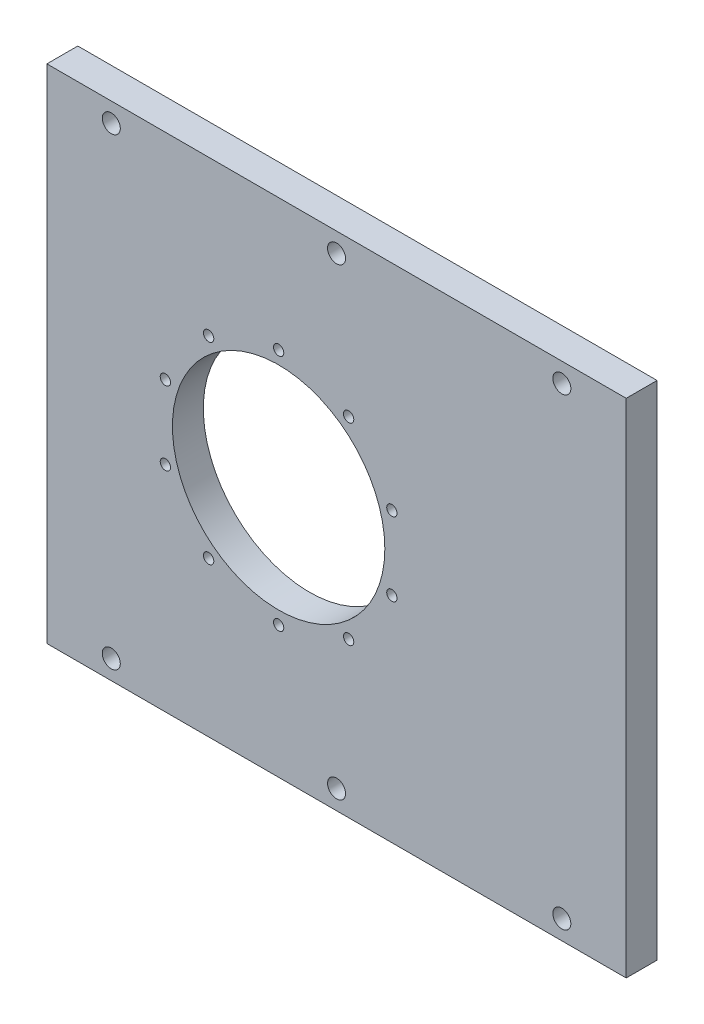
ISO-10303-21;
HEADER;
FILE_DESCRIPTION(('STEP AP214'),'2;1');
FILE_NAME('part.step','',(''),(''),'','','');
FILE_SCHEMA(('AUTOMOTIVE_DESIGN { 1 0 10303 214 1 1 1 1 }'));
ENDSEC;
DATA;
#1=APPLICATION_CONTEXT('core data for automotive mechanical design processes');
#2=APPLICATION_PROTOCOL_DEFINITION('international standard','automotive_design',2000,#1);
#3=PRODUCT_CONTEXT('',#1,'mechanical');
#4=PRODUCT('Part','Part','',(#3));
#5=PRODUCT_RELATED_PRODUCT_CATEGORY('part','',(#4));
#6=PRODUCT_DEFINITION_FORMATION('','',#4);
#7=PRODUCT_DEFINITION_CONTEXT('part definition',#1,'design');
#8=PRODUCT_DEFINITION('design','',#6,#7);
#9=PRODUCT_DEFINITION_SHAPE('','',#8);
#10=(LENGTH_UNIT() NAMED_UNIT(*) SI_UNIT(.MILLI.,.METRE.));
#11=(NAMED_UNIT(*) PLANE_ANGLE_UNIT() SI_UNIT($,.RADIAN.));
#12=(NAMED_UNIT(*) SI_UNIT($,.STERADIAN.) SOLID_ANGLE_UNIT());
#13=UNCERTAINTY_MEASURE_WITH_UNIT(LENGTH_MEASURE(1.E-05),#10,'distance_accuracy_value','');
#14=(GEOMETRIC_REPRESENTATION_CONTEXT(3) GLOBAL_UNCERTAINTY_ASSIGNED_CONTEXT((#13)) GLOBAL_UNIT_ASSIGNED_CONTEXT((#10,
#11,#12)) REPRESENTATION_CONTEXT('',''));
#15=CARTESIAN_POINT('',(0.,0.,0.));
#16=DIRECTION('',(0.,0.,1.));
#17=DIRECTION('',(1.,0.,0.));
#18=AXIS2_PLACEMENT_3D('',#15,#16,#17);
#19=CARTESIAN_POINT('',(0.,0.,24.));
#20=DIRECTION('',(0.,0.,-1.));
#21=DIRECTION('',(-1.,0.,0.));
#22=AXIS2_PLACEMENT_3D('',#19,#20,#21);
#23=PLANE('',#22);
#24=CARTESIAN_POINT('',(42.9727277573017,-28.5840719796826,24.));
#25=DIRECTION('',(0.,0.,-1.));
#26=DIRECTION('',(-1.,0.,0.));
#27=AXIS2_PLACEMENT_3D('',#24,#25,#26);
#28=CIRCLE('',#27,4.00000000000001);
#29=CARTESIAN_POINT('',(38.9727277573017,-28.5840719796826,24.));
#30=VERTEX_POINT('',#29);
#31=EDGE_CURVE('E203',#30,#30,#28,.T.);
#32=ORIENTED_EDGE('',*,*,#31,.T.);
#33=EDGE_LOOP('',(#32));
#34=FACE_BOUND('',#33,.T.);
#35=CARTESIAN_POINT('',(42.9727277573017,28.5840719796826,24.));
#36=DIRECTION('',(0.,0.,-1.));
#37=DIRECTION('',(-1.,0.,0.));
#38=AXIS2_PLACEMENT_3D('',#35,#36,#37);
#39=CIRCLE('',#38,4.00000000000001);
#40=CARTESIAN_POINT('',(38.9727277573017,28.5840719796826,24.));
#41=VERTEX_POINT('',#40);
#42=EDGE_CURVE('E209',#41,#41,#39,.T.);
#43=ORIENTED_EDGE('',*,*,#42,.T.);
#44=EDGE_LOOP('',(#43));
#45=FACE_BOUND('',#44,.T.);
#46=CARTESIAN_POINT('',(9.37013583705376,74.8340719796826,24.));
#47=DIRECTION('',(0.,0.,-1.));
#48=DIRECTION('',(-1.,0.,0.));
#49=AXIS2_PLACEMENT_3D('',#46,#47,#48);
#50=CIRCLE('',#49,4.);
#51=CARTESIAN_POINT('',(5.37013583705376,74.8340719796826,24.));
#52=VERTEX_POINT('',#51);
#53=EDGE_CURVE('E215',#52,#52,#50,.T.);
#54=ORIENTED_EDGE('',*,*,#53,.T.);
#55=EDGE_LOOP('',(#54));
#56=FACE_BOUND('',#55,.T.);
#57=CARTESIAN_POINT('',(-45.,92.5,24.));
#58=DIRECTION('',(0.,0.,-1.));
#59=DIRECTION('',(-1.,0.,0.));
#60=AXIS2_PLACEMENT_3D('',#57,#58,#59);
#61=CIRCLE('',#60,3.99999999999997);
#62=CARTESIAN_POINT('',(-49.,92.5,24.));
#63=VERTEX_POINT('',#62);
#64=EDGE_CURVE('E180',#63,#63,#61,.T.);
#65=ORIENTED_EDGE('',*,*,#64,.T.);
#66=EDGE_LOOP('',(#65));
#67=FACE_BOUND('',#66,.T.);
#68=CARTESIAN_POINT('',(-99.3701358370538,74.8340719796826,24.));
#69=DIRECTION('',(0.,0.,-1.));
#70=DIRECTION('',(-1.,0.,0.));
#71=AXIS2_PLACEMENT_3D('',#68,#69,#70);
#72=CIRCLE('',#71,4.00000000000001);
#73=CARTESIAN_POINT('',(-103.370135837054,74.8340719796826,24.));
#74=VERTEX_POINT('',#73);
#75=EDGE_CURVE('E179',#74,#74,#72,.T.);
#76=ORIENTED_EDGE('',*,*,#75,.T.);
#77=EDGE_LOOP('',(#76));
#78=FACE_BOUND('',#77,.T.);
#79=CARTESIAN_POINT('',(-132.972727757302,28.5840719796826,24.));
#80=DIRECTION('',(0.,0.,-1.));
#81=DIRECTION('',(-1.,0.,0.));
#82=AXIS2_PLACEMENT_3D('',#79,#80,#81);
#83=CIRCLE('',#82,3.99999999999999);
#84=CARTESIAN_POINT('',(-136.972727757302,28.5840719796826,24.));
#85=VERTEX_POINT('',#84);
#86=EDGE_CURVE('E186',#85,#85,#83,.T.);
#87=ORIENTED_EDGE('',*,*,#86,.T.);
#88=EDGE_LOOP('',(#87));
#89=FACE_BOUND('',#88,.T.);
#90=CARTESIAN_POINT('',(175.,180.,24.));
#91=DIRECTION('',(0.,0.,-1.));
#92=DIRECTION('',(-1.,0.,0.));
#93=AXIS2_PLACEMENT_3D('',#90,#91,#92);
#94=CIRCLE('',#93,7.00000000000002);
#95=CARTESIAN_POINT('',(168.,180.,24.));
#96=VERTEX_POINT('',#95);
#97=EDGE_CURVE('E192',#96,#96,#94,.T.);
#98=ORIENTED_EDGE('',*,*,#97,.T.);
#99=EDGE_LOOP('',(#98));
#100=FACE_BOUND('',#99,.T.);
#101=CARTESIAN_POINT('',(0.,180.,24.));
#102=DIRECTION('',(0.,0.,-1.));
#103=DIRECTION('',(-1.,0.,0.));
#104=AXIS2_PLACEMENT_3D('',#101,#102,#103);
#105=CIRCLE('',#104,7.);
#106=CARTESIAN_POINT('',(-7.,180.,24.));
#107=VERTEX_POINT('',#106);
#108=EDGE_CURVE('E174',#107,#107,#105,.T.);
#109=ORIENTED_EDGE('',*,*,#108,.T.);
#110=EDGE_LOOP('',(#109));
#111=FACE_BOUND('',#110,.T.);
#112=CARTESIAN_POINT('',(9.37013583705375,-74.8340719796826,24.));
#113=DIRECTION('',(0.,0.,-1.));
#114=DIRECTION('',(-1.,0.,0.));
#115=AXIS2_PLACEMENT_3D('',#112,#113,#114);
#116=CIRCLE('',#115,4.00000000000002);
#117=CARTESIAN_POINT('',(5.37013583705373,-74.8340719796826,24.));
#118=VERTEX_POINT('',#117);
#119=EDGE_CURVE('E204',#118,#118,#116,.T.);
#120=ORIENTED_EDGE('',*,*,#119,.T.);
#121=EDGE_LOOP('',(#120));
#122=FACE_BOUND('',#121,.T.);
#123=CARTESIAN_POINT('',(-45.,-92.5,24.));
#124=DIRECTION('',(0.,0.,-1.));
#125=DIRECTION('',(-1.,0.,0.));
#126=AXIS2_PLACEMENT_3D('',#123,#124,#125);
#127=CIRCLE('',#126,4.00000000000001);
#128=CARTESIAN_POINT('',(-49.,-92.5,24.));
#129=VERTEX_POINT('',#128);
#130=EDGE_CURVE('E256',#129,#129,#127,.T.);
#131=ORIENTED_EDGE('',*,*,#130,.T.);
#132=EDGE_LOOP('',(#131));
#133=FACE_BOUND('',#132,.T.);
#134=CARTESIAN_POINT('',(-99.3701358370538,-74.8340719796826,24.));
#135=DIRECTION('',(0.,0.,-1.));
#136=DIRECTION('',(-1.,0.,0.));
#137=AXIS2_PLACEMENT_3D('',#134,#135,#136);
#138=CIRCLE('',#137,4.00000000000002);
#139=CARTESIAN_POINT('',(-103.370135837054,-74.8340719796826,24.));
#140=VERTEX_POINT('',#139);
#141=EDGE_CURVE('E250',#140,#140,#138,.T.);
#142=ORIENTED_EDGE('',*,*,#141,.T.);
#143=EDGE_LOOP('',(#142));
#144=FACE_BOUND('',#143,.T.);
#145=CARTESIAN_POINT('',(-132.972727757302,-28.5840719796827,24.));
#146=DIRECTION('',(0.,0.,-1.));
#147=DIRECTION('',(-1.,0.,0.));
#148=AXIS2_PLACEMENT_3D('',#145,#146,#147);
#149=CIRCLE('',#148,4.00000000000002);
#150=CARTESIAN_POINT('',(-136.972727757302,-28.5840719796827,24.));
#151=VERTEX_POINT('',#150);
#152=EDGE_CURVE('E244',#151,#151,#149,.T.);
#153=ORIENTED_EDGE('',*,*,#152,.T.);
#154=EDGE_LOOP('',(#153));
#155=FACE_BOUND('',#154,.T.);
#156=CARTESIAN_POINT('',(-175.,-180.,24.));
#157=DIRECTION('',(0.,0.,-1.));
#158=DIRECTION('',(-1.,0.,0.));
#159=AXIS2_PLACEMENT_3D('',#156,#157,#158);
#160=CIRCLE('',#159,7.00000000000002);
#161=CARTESIAN_POINT('',(-182.,-180.,24.));
#162=VERTEX_POINT('',#161);
#163=EDGE_CURVE('E238',#162,#162,#160,.T.);
#164=ORIENTED_EDGE('',*,*,#163,.T.);
#165=EDGE_LOOP('',(#164));
#166=FACE_BOUND('',#165,.T.);
#167=CARTESIAN_POINT('',(0.,-180.,24.));
#168=DIRECTION('',(0.,0.,-1.));
#169=DIRECTION('',(-1.,0.,0.));
#170=AXIS2_PLACEMENT_3D('',#167,#168,#169);
#171=CIRCLE('',#170,7.);
#172=CARTESIAN_POINT('',(-7.,-180.,24.));
#173=VERTEX_POINT('',#172);
#174=EDGE_CURVE('E232',#173,#173,#171,.T.);
#175=ORIENTED_EDGE('',*,*,#174,.T.);
#176=EDGE_LOOP('',(#175));
#177=FACE_BOUND('',#176,.T.);
#178=CARTESIAN_POINT('',(175.,-180.,24.));
#179=DIRECTION('',(0.,0.,-1.));
#180=DIRECTION('',(-1.,0.,0.));
#181=AXIS2_PLACEMENT_3D('',#178,#179,#180);
#182=CIRCLE('',#181,7.00000000000002);
#183=CARTESIAN_POINT('',(168.,-180.,24.));
#184=VERTEX_POINT('',#183);
#185=EDGE_CURVE('E226',#184,#184,#182,.T.);
#186=ORIENTED_EDGE('',*,*,#185,.T.);
#187=EDGE_LOOP('',(#186));
#188=FACE_BOUND('',#187,.T.);
#189=CARTESIAN_POINT('',(-175.,180.,24.));
#190=DIRECTION('',(0.,0.,-1.));
#191=DIRECTION('',(-1.,0.,0.));
#192=AXIS2_PLACEMENT_3D('',#189,#190,#191);
#193=CIRCLE('',#192,7.00000000000002);
#194=CARTESIAN_POINT('',(-182.,180.,24.));
#195=VERTEX_POINT('',#194);
#196=EDGE_CURVE('E170',#195,#195,#193,.T.);
#197=ORIENTED_EDGE('',*,*,#196,.T.);
#198=EDGE_LOOP('',(#197));
#199=FACE_BOUND('',#198,.T.);
#200=DIRECTION('',(1.,0.,0.));
#201=VECTOR('',#200,1.);
#202=CARTESIAN_POINT('',(-225.,195.,24.));
#203=LINE('',#202,#201);
#204=CARTESIAN_POINT('',(-225.,195.,24.));
#205=VERTEX_POINT('',#204);
#206=CARTESIAN_POINT('',(225.,195.,24.));
#207=VERTEX_POINT('',#206);
#208=EDGE_CURVE('E113',#205,#207,#203,.T.);
#209=ORIENTED_EDGE('',*,*,#208,.F.);
#210=DIRECTION('',(0.,-1.,0.));
#211=VECTOR('',#210,1.);
#212=CARTESIAN_POINT('',(-225.,195.,24.));
#213=LINE('',#212,#211);
#214=CARTESIAN_POINT('',(-225.,-195.,24.));
#215=VERTEX_POINT('',#214);
#216=EDGE_CURVE('E103',#205,#215,#213,.T.);
#217=ORIENTED_EDGE('',*,*,#216,.T.);
#218=DIRECTION('',(1.,0.,0.));
#219=VECTOR('',#218,1.);
#220=CARTESIAN_POINT('',(-225.,-195.,24.));
#221=LINE('',#220,#219);
#222=CARTESIAN_POINT('',(225.,-195.,24.));
#223=VERTEX_POINT('',#222);
#224=EDGE_CURVE('E98',#215,#223,#221,.T.);
#225=ORIENTED_EDGE('',*,*,#224,.T.);
#226=DIRECTION('',(0.,-1.,0.));
#227=VECTOR('',#226,1.);
#228=CARTESIAN_POINT('',(225.,195.,24.));
#229=LINE('',#228,#227);
#230=EDGE_CURVE('E102',#207,#223,#229,.T.);
#231=ORIENTED_EDGE('',*,*,#230,.F.);
#232=EDGE_LOOP('',(#209,#217,#225,#231));
#233=FACE_BOUND('',#232,.T.);
#234=CARTESIAN_POINT('',(-45.,0.,24.));
#235=DIRECTION('',(0.,0.,1.));
#236=DIRECTION('',(1.,0.,0.));
#237=AXIS2_PLACEMENT_3D('',#234,#235,#236);
#238=CIRCLE('',#237,82.5);
#239=CARTESIAN_POINT('',(37.5,0.,24.));
#240=VERTEX_POINT('',#239);
#241=EDGE_CURVE('E123',#240,#240,#238,.T.);
#242=ORIENTED_EDGE('',*,*,#241,.F.);
#243=EDGE_LOOP('',(#242));
#244=FACE_BOUND('',#243,.T.);
#245=ADVANCED_FACE('F52',(#34,#45,#56,#67,#78,#89,#100,#111,#122,#133,#144,#155,#166,#177,#188,
#199,#233,#244),#23,.F.);
#246=CARTESIAN_POINT('',(0.,0.,0.));
#247=DIRECTION('',(0.,0.,-1.));
#248=DIRECTION('',(-1.,0.,0.));
#249=AXIS2_PLACEMENT_3D('',#246,#247,#248);
#250=PLANE('',#249);
#251=DIRECTION('',(1.,0.,0.));
#252=VECTOR('',#251,1.);
#253=CARTESIAN_POINT('',(-225.,195.,0.));
#254=LINE('',#253,#252);
#255=CARTESIAN_POINT('',(-225.,195.,0.));
#256=VERTEX_POINT('',#255);
#257=CARTESIAN_POINT('',(225.,195.,0.));
#258=VERTEX_POINT('',#257);
#259=EDGE_CURVE('E119',#256,#258,#254,.T.);
#260=ORIENTED_EDGE('',*,*,#259,.T.);
#261=DIRECTION('',(0.,-1.,0.));
#262=VECTOR('',#261,1.);
#263=CARTESIAN_POINT('',(225.,195.,0.));
#264=LINE('',#263,#262);
#265=CARTESIAN_POINT('',(225.,-195.,0.));
#266=VERTEX_POINT('',#265);
#267=EDGE_CURVE('E122',#258,#266,#264,.T.);
#268=ORIENTED_EDGE('',*,*,#267,.T.);
#269=DIRECTION('',(1.,0.,0.));
#270=VECTOR('',#269,1.);
#271=CARTESIAN_POINT('',(-225.,-195.,0.));
#272=LINE('',#271,#270);
#273=CARTESIAN_POINT('',(-225.,-195.,0.));
#274=VERTEX_POINT('',#273);
#275=EDGE_CURVE('E110',#274,#266,#272,.T.);
#276=ORIENTED_EDGE('',*,*,#275,.F.);
#277=DIRECTION('',(0.,-1.,0.));
#278=VECTOR('',#277,1.);
#279=CARTESIAN_POINT('',(-225.,195.,0.));
#280=LINE('',#279,#278);
#281=EDGE_CURVE('E86',#256,#274,#280,.T.);
#282=ORIENTED_EDGE('',*,*,#281,.F.);
#283=EDGE_LOOP('',(#260,#268,#276,#282));
#284=FACE_BOUND('',#283,.T.);
#285=CARTESIAN_POINT('',(-45.,0.,0.));
#286=DIRECTION('',(0.,0.,1.));
#287=DIRECTION('',(1.,0.,0.));
#288=AXIS2_PLACEMENT_3D('',#285,#286,#287);
#289=CIRCLE('',#288,82.5);
#290=CARTESIAN_POINT('',(37.5,0.,0.));
#291=VERTEX_POINT('',#290);
#292=EDGE_CURVE('E166',#291,#291,#289,.T.);
#293=ORIENTED_EDGE('',*,*,#292,.T.);
#294=EDGE_LOOP('',(#293));
#295=FACE_BOUND('',#294,.T.);
#296=ADVANCED_FACE('F128',(#284,#295),#250,.T.);
#297=CARTESIAN_POINT('',(-225.,195.,24.));
#298=DIRECTION('',(0.,1.,0.));
#299=DIRECTION('',(0.,0.,1.));
#300=AXIS2_PLACEMENT_3D('',#297,#298,#299);
#301=PLANE('',#300);
#302=ORIENTED_EDGE('',*,*,#259,.F.);
#303=DIRECTION('',(0.,0.,-1.));
#304=VECTOR('',#303,1.);
#305=CARTESIAN_POINT('',(-225.,195.,24.));
#306=LINE('',#305,#304);
#307=EDGE_CURVE('E12',#205,#256,#306,.T.);
#308=ORIENTED_EDGE('',*,*,#307,.F.);
#309=ORIENTED_EDGE('',*,*,#208,.T.);
#310=DIRECTION('',(0.,0.,-1.));
#311=VECTOR('',#310,1.);
#312=CARTESIAN_POINT('',(225.,195.,24.));
#313=LINE('',#312,#311);
#314=EDGE_CURVE('E56',#207,#258,#313,.T.);
#315=ORIENTED_EDGE('',*,*,#314,.T.);
#316=EDGE_LOOP('',(#302,#308,#309,#315));
#317=FACE_BOUND('',#316,.T.);
#318=ADVANCED_FACE('F54',(#317),#301,.T.);
#319=CARTESIAN_POINT('',(-225.,195.,24.));
#320=DIRECTION('',(1.,0.,0.));
#321=DIRECTION('',(0.,1.,0.));
#322=AXIS2_PLACEMENT_3D('',#319,#320,#321);
#323=PLANE('',#322);
#324=ORIENTED_EDGE('',*,*,#281,.T.);
#325=DIRECTION('',(0.,0.,-1.));
#326=VECTOR('',#325,1.);
#327=CARTESIAN_POINT('',(-225.,-195.,24.));
#328=LINE('',#327,#326);
#329=EDGE_CURVE('E62',#215,#274,#328,.T.);
#330=ORIENTED_EDGE('',*,*,#329,.F.);
#331=ORIENTED_EDGE('',*,*,#216,.F.);
#332=ORIENTED_EDGE('',*,*,#307,.T.);
#333=EDGE_LOOP('',(#324,#330,#331,#332));
#334=FACE_BOUND('',#333,.T.);
#335=ADVANCED_FACE('F131',(#334),#323,.F.);
#336=CARTESIAN_POINT('',(-225.,-195.,24.));
#337=DIRECTION('',(0.,1.,0.));
#338=DIRECTION('',(0.,0.,1.));
#339=AXIS2_PLACEMENT_3D('',#336,#337,#338);
#340=PLANE('',#339);
#341=ORIENTED_EDGE('',*,*,#275,.T.);
#342=DIRECTION('',(0.,0.,-1.));
#343=VECTOR('',#342,1.);
#344=CARTESIAN_POINT('',(225.,-195.,24.));
#345=LINE('',#344,#343);
#346=EDGE_CURVE('E107',#223,#266,#345,.T.);
#347=ORIENTED_EDGE('',*,*,#346,.F.);
#348=ORIENTED_EDGE('',*,*,#224,.F.);
#349=ORIENTED_EDGE('',*,*,#329,.T.);
#350=EDGE_LOOP('',(#341,#347,#348,#349));
#351=FACE_BOUND('',#350,.T.);
#352=ADVANCED_FACE('F108',(#351),#340,.F.);
#353=CARTESIAN_POINT('',(225.,195.,24.));
#354=DIRECTION('',(1.,0.,0.));
#355=DIRECTION('',(0.,1.,0.));
#356=AXIS2_PLACEMENT_3D('',#353,#354,#355);
#357=PLANE('',#356);
#358=ORIENTED_EDGE('',*,*,#267,.F.);
#359=ORIENTED_EDGE('',*,*,#314,.F.);
#360=ORIENTED_EDGE('',*,*,#230,.T.);
#361=ORIENTED_EDGE('',*,*,#346,.T.);
#362=EDGE_LOOP('',(#358,#359,#360,#361));
#363=FACE_BOUND('',#362,.T.);
#364=ADVANCED_FACE('F112',(#363),#357,.T.);
#365=CARTESIAN_POINT('',(-45.,0.,24.));
#366=DIRECTION('',(0.,0.,-1.));
#367=DIRECTION('',(-1.,0.,0.));
#368=AXIS2_PLACEMENT_3D('',#365,#366,#367);
#369=CYLINDRICAL_SURFACE('',#368,82.5);
#370=ORIENTED_EDGE('',*,*,#241,.T.);
#371=EDGE_LOOP('',(#370));
#372=FACE_BOUND('',#371,.T.);
#373=ORIENTED_EDGE('',*,*,#292,.F.);
#374=EDGE_LOOP('',(#373));
#375=FACE_BOUND('',#374,.T.);
#376=ADVANCED_FACE('F146',(#372,#375),#369,.F.);
#377=CARTESIAN_POINT('',(-175.,180.,6.));
#378=DIRECTION('',(0.,0.,1.));
#379=DIRECTION('',(1.,0.,0.));
#380=AXIS2_PLACEMENT_3D('',#377,#378,#379);
#381=CYLINDRICAL_SURFACE('',#380,7.00000000000002);
#382=CARTESIAN_POINT('',(-175.,180.,6.));
#383=DIRECTION('',(0.,0.,-1.));
#384=DIRECTION('',(-1.,0.,0.));
#385=AXIS2_PLACEMENT_3D('',#382,#383,#384);
#386=CIRCLE('',#385,7.00000000000002);
#387=CARTESIAN_POINT('',(-182.,180.,6.));
#388=VERTEX_POINT('',#387);
#389=EDGE_CURVE('E167',#388,#388,#386,.T.);
#390=ORIENTED_EDGE('',*,*,#389,.T.);
#391=EDGE_LOOP('',(#390));
#392=FACE_BOUND('',#391,.T.);
#393=ORIENTED_EDGE('',*,*,#196,.F.);
#394=EDGE_LOOP('',(#393));
#395=FACE_BOUND('',#394,.T.);
#396=ADVANCED_FACE('F154',(#392,#395),#381,.F.);
#397=CARTESIAN_POINT('',(-175.,180.,6.));
#398=DIRECTION('',(0.,0.,-1.));
#399=DIRECTION('',(-1.,0.,0.));
#400=AXIS2_PLACEMENT_3D('',#397,#398,#399);
#401=PLANE('',#400);
#402=ORIENTED_EDGE('',*,*,#389,.F.);
#403=EDGE_LOOP('',(#402));
#404=FACE_BOUND('',#403,.T.);
#405=ADVANCED_FACE('F159',(#404),#401,.F.);
#406=CARTESIAN_POINT('',(175.,-180.,6.));
#407=DIRECTION('',(0.,0.,1.));
#408=DIRECTION('',(1.,0.,0.));
#409=AXIS2_PLACEMENT_3D('',#406,#407,#408);
#410=CYLINDRICAL_SURFACE('',#409,7.00000000000002);
#411=CARTESIAN_POINT('',(175.,-180.,6.));
#412=DIRECTION('',(0.,0.,-1.));
#413=DIRECTION('',(-1.,0.,0.));
#414=AXIS2_PLACEMENT_3D('',#411,#412,#413);
#415=CIRCLE('',#414,7.00000000000002);
#416=CARTESIAN_POINT('',(168.,-180.,6.));
#417=VERTEX_POINT('',#416);
#418=EDGE_CURVE('E223',#417,#417,#415,.T.);
#419=ORIENTED_EDGE('',*,*,#418,.T.);
#420=EDGE_LOOP('',(#419));
#421=FACE_BOUND('',#420,.T.);
#422=ORIENTED_EDGE('',*,*,#185,.F.);
#423=EDGE_LOOP('',(#422));
#424=FACE_BOUND('',#423,.T.);
#425=ADVANCED_FACE('F320',(#421,#424),#410,.F.);
#426=CARTESIAN_POINT('',(175.,-180.,6.));
#427=DIRECTION('',(0.,0.,-1.));
#428=DIRECTION('',(-1.,0.,0.));
#429=AXIS2_PLACEMENT_3D('',#426,#427,#428);
#430=PLANE('',#429);
#431=ORIENTED_EDGE('',*,*,#418,.F.);
#432=EDGE_LOOP('',(#431));
#433=FACE_BOUND('',#432,.T.);
#434=ADVANCED_FACE('F315',(#433),#430,.F.);
#435=CARTESIAN_POINT('',(0.,-180.,6.));
#436=DIRECTION('',(0.,0.,1.));
#437=DIRECTION('',(1.,0.,0.));
#438=AXIS2_PLACEMENT_3D('',#435,#436,#437);
#439=CYLINDRICAL_SURFACE('',#438,7.);
#440=CARTESIAN_POINT('',(0.,-180.,6.));
#441=DIRECTION('',(0.,0.,-1.));
#442=DIRECTION('',(-1.,0.,0.));
#443=AXIS2_PLACEMENT_3D('',#440,#441,#442);
#444=CIRCLE('',#443,7.);
#445=CARTESIAN_POINT('',(-7.,-180.,6.));
#446=VERTEX_POINT('',#445);
#447=EDGE_CURVE('E229',#446,#446,#444,.T.);
#448=ORIENTED_EDGE('',*,*,#447,.T.);
#449=EDGE_LOOP('',(#448));
#450=FACE_BOUND('',#449,.T.);
#451=ORIENTED_EDGE('',*,*,#174,.F.);
#452=EDGE_LOOP('',(#451));
#453=FACE_BOUND('',#452,.T.);
#454=ADVANCED_FACE('F312',(#450,#453),#439,.F.);
#455=CARTESIAN_POINT('',(0.,-180.,6.));
#456=DIRECTION('',(0.,0.,-1.));
#457=DIRECTION('',(-1.,0.,0.));
#458=AXIS2_PLACEMENT_3D('',#455,#456,#457);
#459=PLANE('',#458);
#460=ORIENTED_EDGE('',*,*,#447,.F.);
#461=EDGE_LOOP('',(#460));
#462=FACE_BOUND('',#461,.T.);
#463=ADVANCED_FACE('F307',(#462),#459,.F.);
#464=CARTESIAN_POINT('',(-175.,-180.,6.));
#465=DIRECTION('',(0.,0.,1.));
#466=DIRECTION('',(1.,0.,0.));
#467=AXIS2_PLACEMENT_3D('',#464,#465,#466);
#468=CYLINDRICAL_SURFACE('',#467,7.00000000000002);
#469=CARTESIAN_POINT('',(-175.,-180.,6.));
#470=DIRECTION('',(0.,0.,-1.));
#471=DIRECTION('',(-1.,0.,0.));
#472=AXIS2_PLACEMENT_3D('',#469,#470,#471);
#473=CIRCLE('',#472,7.00000000000002);
#474=CARTESIAN_POINT('',(-182.,-180.,6.));
#475=VERTEX_POINT('',#474);
#476=EDGE_CURVE('E235',#475,#475,#473,.T.);
#477=ORIENTED_EDGE('',*,*,#476,.T.);
#478=EDGE_LOOP('',(#477));
#479=FACE_BOUND('',#478,.T.);
#480=ORIENTED_EDGE('',*,*,#163,.F.);
#481=EDGE_LOOP('',(#480));
#482=FACE_BOUND('',#481,.T.);
#483=ADVANCED_FACE('F304',(#479,#482),#468,.F.);
#484=CARTESIAN_POINT('',(-175.,-180.,6.));
#485=DIRECTION('',(0.,0.,-1.));
#486=DIRECTION('',(-1.,0.,0.));
#487=AXIS2_PLACEMENT_3D('',#484,#485,#486);
#488=PLANE('',#487);
#489=ORIENTED_EDGE('',*,*,#476,.F.);
#490=EDGE_LOOP('',(#489));
#491=FACE_BOUND('',#490,.T.);
#492=ADVANCED_FACE('F299',(#491),#488,.F.);
#493=CARTESIAN_POINT('',(-132.972727757302,-28.5840719796827,6.));
#494=DIRECTION('',(0.,0.,1.));
#495=DIRECTION('',(1.,0.,0.));
#496=AXIS2_PLACEMENT_3D('',#493,#494,#495);
#497=CYLINDRICAL_SURFACE('',#496,4.00000000000002);
#498=CARTESIAN_POINT('',(-132.972727757302,-28.5840719796827,6.));
#499=DIRECTION('',(0.,0.,-1.));
#500=DIRECTION('',(-1.,0.,0.));
#501=AXIS2_PLACEMENT_3D('',#498,#499,#500);
#502=CIRCLE('',#501,4.00000000000002);
#503=CARTESIAN_POINT('',(-136.972727757302,-28.5840719796827,6.));
#504=VERTEX_POINT('',#503);
#505=EDGE_CURVE('E241',#504,#504,#502,.T.);
#506=ORIENTED_EDGE('',*,*,#505,.T.);
#507=EDGE_LOOP('',(#506));
#508=FACE_BOUND('',#507,.T.);
#509=ORIENTED_EDGE('',*,*,#152,.F.);
#510=EDGE_LOOP('',(#509));
#511=FACE_BOUND('',#510,.T.);
#512=ADVANCED_FACE('F296',(#508,#511),#497,.F.);
#513=CARTESIAN_POINT('',(-132.972727757302,-28.5840719796827,6.));
#514=DIRECTION('',(0.,0.,-1.));
#515=DIRECTION('',(-1.,0.,0.));
#516=AXIS2_PLACEMENT_3D('',#513,#514,#515);
#517=PLANE('',#516);
#518=ORIENTED_EDGE('',*,*,#505,.F.);
#519=EDGE_LOOP('',(#518));
#520=FACE_BOUND('',#519,.T.);
#521=ADVANCED_FACE('F291',(#520),#517,.F.);
#522=CARTESIAN_POINT('',(-99.3701358370538,-74.8340719796826,6.));
#523=DIRECTION('',(0.,0.,1.));
#524=DIRECTION('',(1.,0.,0.));
#525=AXIS2_PLACEMENT_3D('',#522,#523,#524);
#526=CYLINDRICAL_SURFACE('',#525,4.00000000000002);
#527=CARTESIAN_POINT('',(-99.3701358370538,-74.8340719796826,6.));
#528=DIRECTION('',(0.,0.,-1.));
#529=DIRECTION('',(-1.,0.,0.));
#530=AXIS2_PLACEMENT_3D('',#527,#528,#529);
#531=CIRCLE('',#530,4.00000000000002);
#532=CARTESIAN_POINT('',(-103.370135837054,-74.8340719796826,6.));
#533=VERTEX_POINT('',#532);
#534=EDGE_CURVE('E247',#533,#533,#531,.T.);
#535=ORIENTED_EDGE('',*,*,#534,.T.);
#536=EDGE_LOOP('',(#535));
#537=FACE_BOUND('',#536,.T.);
#538=ORIENTED_EDGE('',*,*,#141,.F.);
#539=EDGE_LOOP('',(#538));
#540=FACE_BOUND('',#539,.T.);
#541=ADVANCED_FACE('F288',(#537,#540),#526,.F.);
#542=CARTESIAN_POINT('',(-99.3701358370538,-74.8340719796826,6.));
#543=DIRECTION('',(0.,0.,-1.));
#544=DIRECTION('',(-1.,0.,0.));
#545=AXIS2_PLACEMENT_3D('',#542,#543,#544);
#546=PLANE('',#545);
#547=ORIENTED_EDGE('',*,*,#534,.F.);
#548=EDGE_LOOP('',(#547));
#549=FACE_BOUND('',#548,.T.);
#550=ADVANCED_FACE('F285',(#549),#546,.F.);
#551=CARTESIAN_POINT('',(-45.,-92.5,6.));
#552=DIRECTION('',(0.,0.,1.));
#553=DIRECTION('',(1.,0.,0.));
#554=AXIS2_PLACEMENT_3D('',#551,#552,#553);
#555=CYLINDRICAL_SURFACE('',#554,4.00000000000001);
#556=CARTESIAN_POINT('',(-45.,-92.5,6.));
#557=DIRECTION('',(0.,0.,-1.));
#558=DIRECTION('',(-1.,0.,0.));
#559=AXIS2_PLACEMENT_3D('',#556,#557,#558);
#560=CIRCLE('',#559,4.00000000000001);
#561=CARTESIAN_POINT('',(-49.,-92.5,6.));
#562=VERTEX_POINT('',#561);
#563=EDGE_CURVE('E253',#562,#562,#560,.T.);
#564=ORIENTED_EDGE('',*,*,#563,.T.);
#565=EDGE_LOOP('',(#564));
#566=FACE_BOUND('',#565,.T.);
#567=ORIENTED_EDGE('',*,*,#130,.F.);
#568=EDGE_LOOP('',(#567));
#569=FACE_BOUND('',#568,.T.);
#570=ADVANCED_FACE('F280',(#566,#569),#555,.F.);
#571=CARTESIAN_POINT('',(-45.,-92.5,6.));
#572=DIRECTION('',(0.,0.,-1.));
#573=DIRECTION('',(-1.,0.,0.));
#574=AXIS2_PLACEMENT_3D('',#571,#572,#573);
#575=PLANE('',#574);
#576=ORIENTED_EDGE('',*,*,#563,.F.);
#577=EDGE_LOOP('',(#576));
#578=FACE_BOUND('',#577,.T.);
#579=ADVANCED_FACE('F270',(#578),#575,.F.);
#580=CARTESIAN_POINT('',(9.37013583705375,-74.8340719796826,6.));
#581=DIRECTION('',(0.,0.,1.));
#582=DIRECTION('',(1.,0.,0.));
#583=AXIS2_PLACEMENT_3D('',#580,#581,#582);
#584=CYLINDRICAL_SURFACE('',#583,4.00000000000002);
#585=CARTESIAN_POINT('',(9.37013583705375,-74.8340719796826,6.));
#586=DIRECTION('',(0.,0.,-1.));
#587=DIRECTION('',(-1.,0.,0.));
#588=AXIS2_PLACEMENT_3D('',#585,#586,#587);
#589=CIRCLE('',#588,4.00000000000002);
#590=CARTESIAN_POINT('',(5.37013583705373,-74.8340719796826,6.));
#591=VERTEX_POINT('',#590);
#592=EDGE_CURVE('E259',#591,#591,#589,.T.);
#593=ORIENTED_EDGE('',*,*,#592,.T.);
#594=EDGE_LOOP('',(#593));
#595=FACE_BOUND('',#594,.T.);
#596=ORIENTED_EDGE('',*,*,#119,.F.);
#597=EDGE_LOOP('',(#596));
#598=FACE_BOUND('',#597,.T.);
#599=ADVANCED_FACE('F267',(#595,#598),#584,.F.);
#600=CARTESIAN_POINT('',(9.37013583705375,-74.8340719796826,6.));
#601=DIRECTION('',(0.,0.,-1.));
#602=DIRECTION('',(-1.,0.,0.));
#603=AXIS2_PLACEMENT_3D('',#600,#601,#602);
#604=PLANE('',#603);
#605=ORIENTED_EDGE('',*,*,#592,.F.);
#606=EDGE_LOOP('',(#605));
#607=FACE_BOUND('',#606,.T.);
#608=ADVANCED_FACE('F269',(#607),#604,.F.);
#609=CARTESIAN_POINT('',(0.,180.,6.));
#610=DIRECTION('',(0.,0.,1.));
#611=DIRECTION('',(1.,0.,0.));
#612=AXIS2_PLACEMENT_3D('',#609,#610,#611);
#613=CYLINDRICAL_SURFACE('',#612,7.);
#614=CARTESIAN_POINT('',(0.,180.,6.));
#615=DIRECTION('',(0.,0.,-1.));
#616=DIRECTION('',(-1.,0.,0.));
#617=AXIS2_PLACEMENT_3D('',#614,#615,#616);
#618=CIRCLE('',#617,7.);
#619=CARTESIAN_POINT('',(-7.,180.,6.));
#620=VERTEX_POINT('',#619);
#621=EDGE_CURVE('E195',#620,#620,#618,.T.);
#622=ORIENTED_EDGE('',*,*,#621,.T.);
#623=EDGE_LOOP('',(#622));
#624=FACE_BOUND('',#623,.T.);
#625=ORIENTED_EDGE('',*,*,#108,.F.);
#626=EDGE_LOOP('',(#625));
#627=FACE_BOUND('',#626,.T.);
#628=ADVANCED_FACE('F277',(#624,#627),#613,.F.);
#629=CARTESIAN_POINT('',(0.,180.,6.));
#630=DIRECTION('',(0.,0.,-1.));
#631=DIRECTION('',(-1.,0.,0.));
#632=AXIS2_PLACEMENT_3D('',#629,#630,#631);
#633=PLANE('',#632);
#634=ORIENTED_EDGE('',*,*,#621,.F.);
#635=EDGE_LOOP('',(#634));
#636=FACE_BOUND('',#635,.T.);
#637=ADVANCED_FACE('F362',(#636),#633,.F.);
#638=CARTESIAN_POINT('',(175.,180.,6.));
#639=DIRECTION('',(0.,0.,1.));
#640=DIRECTION('',(1.,0.,0.));
#641=AXIS2_PLACEMENT_3D('',#638,#639,#640);
#642=CYLINDRICAL_SURFACE('',#641,7.00000000000002);
#643=CARTESIAN_POINT('',(175.,180.,6.));
#644=DIRECTION('',(0.,0.,-1.));
#645=DIRECTION('',(-1.,0.,0.));
#646=AXIS2_PLACEMENT_3D('',#643,#644,#645);
#647=CIRCLE('',#646,7.00000000000002);
#648=CARTESIAN_POINT('',(168.,180.,6.));
#649=VERTEX_POINT('',#648);
#650=EDGE_CURVE('E189',#649,#649,#647,.T.);
#651=ORIENTED_EDGE('',*,*,#650,.T.);
#652=EDGE_LOOP('',(#651));
#653=FACE_BOUND('',#652,.T.);
#654=ORIENTED_EDGE('',*,*,#97,.F.);
#655=EDGE_LOOP('',(#654));
#656=FACE_BOUND('',#655,.T.);
#657=ADVANCED_FACE('F366',(#653,#656),#642,.F.);
#658=CARTESIAN_POINT('',(175.,180.,6.));
#659=DIRECTION('',(0.,0.,-1.));
#660=DIRECTION('',(-1.,0.,0.));
#661=AXIS2_PLACEMENT_3D('',#658,#659,#660);
#662=PLANE('',#661);
#663=ORIENTED_EDGE('',*,*,#650,.F.);
#664=EDGE_LOOP('',(#663));
#665=FACE_BOUND('',#664,.T.);
#666=ADVANCED_FACE('F370',(#665),#662,.F.);
#667=CARTESIAN_POINT('',(-132.972727757302,28.5840719796826,6.));
#668=DIRECTION('',(0.,0.,1.));
#669=DIRECTION('',(1.,0.,0.));
#670=AXIS2_PLACEMENT_3D('',#667,#668,#669);
#671=CYLINDRICAL_SURFACE('',#670,3.99999999999999);
#672=CARTESIAN_POINT('',(-132.972727757302,28.5840719796826,6.));
#673=DIRECTION('',(0.,0.,-1.));
#674=DIRECTION('',(-1.,0.,0.));
#675=AXIS2_PLACEMENT_3D('',#672,#673,#674);
#676=CIRCLE('',#675,3.99999999999999);
#677=CARTESIAN_POINT('',(-136.972727757302,28.5840719796826,6.));
#678=VERTEX_POINT('',#677);
#679=EDGE_CURVE('E183',#678,#678,#676,.T.);
#680=ORIENTED_EDGE('',*,*,#679,.T.);
#681=EDGE_LOOP('',(#680));
#682=FACE_BOUND('',#681,.T.);
#683=ORIENTED_EDGE('',*,*,#86,.F.);
#684=EDGE_LOOP('',(#683));
#685=FACE_BOUND('',#684,.T.);
#686=ADVANCED_FACE('F374',(#682,#685),#671,.F.);
#687=CARTESIAN_POINT('',(-132.972727757302,28.5840719796826,6.));
#688=DIRECTION('',(0.,0.,-1.));
#689=DIRECTION('',(-1.,0.,0.));
#690=AXIS2_PLACEMENT_3D('',#687,#688,#689);
#691=PLANE('',#690);
#692=ORIENTED_EDGE('',*,*,#679,.F.);
#693=EDGE_LOOP('',(#692));
#694=FACE_BOUND('',#693,.T.);
#695=ADVANCED_FACE('F378',(#694),#691,.F.);
#696=CARTESIAN_POINT('',(-99.3701358370538,74.8340719796826,6.));
#697=DIRECTION('',(0.,0.,1.));
#698=DIRECTION('',(1.,0.,0.));
#699=AXIS2_PLACEMENT_3D('',#696,#697,#698);
#700=CYLINDRICAL_SURFACE('',#699,4.00000000000001);
#701=CARTESIAN_POINT('',(-99.3701358370538,74.8340719796826,6.));
#702=DIRECTION('',(0.,0.,-1.));
#703=DIRECTION('',(-1.,0.,0.));
#704=AXIS2_PLACEMENT_3D('',#701,#702,#703);
#705=CIRCLE('',#704,4.00000000000001);
#706=CARTESIAN_POINT('',(-103.370135837054,74.8340719796826,6.));
#707=VERTEX_POINT('',#706);
#708=EDGE_CURVE('E176',#707,#707,#705,.T.);
#709=ORIENTED_EDGE('',*,*,#708,.T.);
#710=EDGE_LOOP('',(#709));
#711=FACE_BOUND('',#710,.T.);
#712=ORIENTED_EDGE('',*,*,#75,.F.);
#713=EDGE_LOOP('',(#712));
#714=FACE_BOUND('',#713,.T.);
#715=ADVANCED_FACE('F382',(#711,#714),#700,.F.);
#716=CARTESIAN_POINT('',(-99.3701358370538,74.8340719796826,6.));
#717=DIRECTION('',(0.,0.,-1.));
#718=DIRECTION('',(-1.,0.,0.));
#719=AXIS2_PLACEMENT_3D('',#716,#717,#718);
#720=PLANE('',#719);
#721=ORIENTED_EDGE('',*,*,#708,.F.);
#722=EDGE_LOOP('',(#721));
#723=FACE_BOUND('',#722,.T.);
#724=ADVANCED_FACE('F331',(#723),#720,.F.);
#725=CARTESIAN_POINT('',(-45.,92.5,6.));
#726=DIRECTION('',(0.,0.,1.));
#727=DIRECTION('',(1.,0.,0.));
#728=AXIS2_PLACEMENT_3D('',#725,#726,#727);
#729=CYLINDRICAL_SURFACE('',#728,3.99999999999997);
#730=CARTESIAN_POINT('',(-45.,92.5,6.));
#731=DIRECTION('',(0.,0.,-1.));
#732=DIRECTION('',(-1.,0.,0.));
#733=AXIS2_PLACEMENT_3D('',#730,#731,#732);
#734=CIRCLE('',#733,3.99999999999997);
#735=CARTESIAN_POINT('',(-49.,92.5,6.));
#736=VERTEX_POINT('',#735);
#737=EDGE_CURVE('E218',#736,#736,#734,.T.);
#738=ORIENTED_EDGE('',*,*,#737,.T.);
#739=EDGE_LOOP('',(#738));
#740=FACE_BOUND('',#739,.T.);
#741=ORIENTED_EDGE('',*,*,#64,.F.);
#742=EDGE_LOOP('',(#741));
#743=FACE_BOUND('',#742,.T.);
#744=ADVANCED_FACE('F327',(#740,#743),#729,.F.);
#745=CARTESIAN_POINT('',(-45.,92.5,6.));
#746=DIRECTION('',(0.,0.,-1.));
#747=DIRECTION('',(-1.,0.,0.));
#748=AXIS2_PLACEMENT_3D('',#745,#746,#747);
#749=PLANE('',#748);
#750=ORIENTED_EDGE('',*,*,#737,.F.);
#751=EDGE_LOOP('',(#750));
#752=FACE_BOUND('',#751,.T.);
#753=ADVANCED_FACE('F330',(#752),#749,.F.);
#754=CARTESIAN_POINT('',(9.37013583705376,74.8340719796826,6.));
#755=DIRECTION('',(0.,0.,1.));
#756=DIRECTION('',(1.,0.,0.));
#757=AXIS2_PLACEMENT_3D('',#754,#755,#756);
#758=CYLINDRICAL_SURFACE('',#757,4.);
#759=CARTESIAN_POINT('',(9.37013583705376,74.8340719796826,6.));
#760=DIRECTION('',(0.,0.,-1.));
#761=DIRECTION('',(-1.,0.,0.));
#762=AXIS2_PLACEMENT_3D('',#759,#760,#761);
#763=CIRCLE('',#762,4.);
#764=CARTESIAN_POINT('',(5.37013583705376,74.8340719796826,6.));
#765=VERTEX_POINT('',#764);
#766=EDGE_CURVE('E212',#765,#765,#763,.T.);
#767=ORIENTED_EDGE('',*,*,#766,.T.);
#768=EDGE_LOOP('',(#767));
#769=FACE_BOUND('',#768,.T.);
#770=ORIENTED_EDGE('',*,*,#53,.F.);
#771=EDGE_LOOP('',(#770));
#772=FACE_BOUND('',#771,.T.);
#773=ADVANCED_FACE('F335',(#769,#772),#758,.F.);
#774=CARTESIAN_POINT('',(9.37013583705376,74.8340719796826,6.));
#775=DIRECTION('',(0.,0.,-1.));
#776=DIRECTION('',(-1.,0.,0.));
#777=AXIS2_PLACEMENT_3D('',#774,#775,#776);
#778=PLANE('',#777);
#779=ORIENTED_EDGE('',*,*,#766,.F.);
#780=EDGE_LOOP('',(#779));
#781=FACE_BOUND('',#780,.T.);
#782=ADVANCED_FACE('F339',(#781),#778,.F.);
#783=CARTESIAN_POINT('',(42.9727277573017,28.5840719796826,6.));
#784=DIRECTION('',(0.,0.,1.));
#785=DIRECTION('',(1.,0.,0.));
#786=AXIS2_PLACEMENT_3D('',#783,#784,#785);
#787=CYLINDRICAL_SURFACE('',#786,4.00000000000001);
#788=CARTESIAN_POINT('',(42.9727277573017,28.5840719796826,6.));
#789=DIRECTION('',(0.,0.,-1.));
#790=DIRECTION('',(-1.,0.,0.));
#791=AXIS2_PLACEMENT_3D('',#788,#789,#790);
#792=CIRCLE('',#791,4.00000000000001);
#793=CARTESIAN_POINT('',(38.9727277573017,28.5840719796826,6.));
#794=VERTEX_POINT('',#793);
#795=EDGE_CURVE('E206',#794,#794,#792,.T.);
#796=ORIENTED_EDGE('',*,*,#795,.T.);
#797=EDGE_LOOP('',(#796));
#798=FACE_BOUND('',#797,.T.);
#799=ORIENTED_EDGE('',*,*,#42,.F.);
#800=EDGE_LOOP('',(#799));
#801=FACE_BOUND('',#800,.T.);
#802=ADVANCED_FACE('F343',(#798,#801),#787,.F.);
#803=CARTESIAN_POINT('',(42.9727277573017,28.5840719796826,6.));
#804=DIRECTION('',(0.,0.,-1.));
#805=DIRECTION('',(-1.,0.,0.));
#806=AXIS2_PLACEMENT_3D('',#803,#804,#805);
#807=PLANE('',#806);
#808=ORIENTED_EDGE('',*,*,#795,.F.);
#809=EDGE_LOOP('',(#808));
#810=FACE_BOUND('',#809,.T.);
#811=ADVANCED_FACE('F347',(#810),#807,.F.);
#812=CARTESIAN_POINT('',(42.9727277573017,-28.5840719796826,6.));
#813=DIRECTION('',(0.,0.,1.));
#814=DIRECTION('',(1.,0.,0.));
#815=AXIS2_PLACEMENT_3D('',#812,#813,#814);
#816=CYLINDRICAL_SURFACE('',#815,4.00000000000001);
#817=CARTESIAN_POINT('',(42.9727277573017,-28.5840719796826,6.));
#818=DIRECTION('',(0.,0.,-1.));
#819=DIRECTION('',(-1.,0.,0.));
#820=AXIS2_PLACEMENT_3D('',#817,#818,#819);
#821=CIRCLE('',#820,4.00000000000001);
#822=CARTESIAN_POINT('',(38.9727277573017,-28.5840719796826,6.));
#823=VERTEX_POINT('',#822);
#824=EDGE_CURVE('E200',#823,#823,#821,.T.);
#825=ORIENTED_EDGE('',*,*,#824,.T.);
#826=EDGE_LOOP('',(#825));
#827=FACE_BOUND('',#826,.T.);
#828=ORIENTED_EDGE('',*,*,#31,.F.);
#829=EDGE_LOOP('',(#828));
#830=FACE_BOUND('',#829,.T.);
#831=ADVANCED_FACE('F351',(#827,#830),#816,.F.);
#832=CARTESIAN_POINT('',(42.9727277573017,-28.5840719796826,6.));
#833=DIRECTION('',(0.,0.,-1.));
#834=DIRECTION('',(-1.,0.,0.));
#835=AXIS2_PLACEMENT_3D('',#832,#833,#834);
#836=PLANE('',#835);
#837=ORIENTED_EDGE('',*,*,#824,.F.);
#838=EDGE_LOOP('',(#837));
#839=FACE_BOUND('',#838,.T.);
#840=ADVANCED_FACE('F355',(#839),#836,.F.);
#841=CLOSED_SHELL('',(#245,#296,#318,#335,#352,#364,#376,#396,#405,#425,#434,#454,#463,#483,
#492,#512,#521,#541,#550,#570,#579,#599,#608,#628,#637,#657,#666,#686,#695,#715,#724,#744,#753,
#773,#782,#802,#811,#831,#840));
#842=MANIFOLD_SOLID_BREP('B2',#841);
#843=ADVANCED_BREP_SHAPE_REPRESENTATION('',(#18,#842),#14);
#844=SHAPE_DEFINITION_REPRESENTATION(#9,#843);
ENDSEC;
END-ISO-10303-21;
